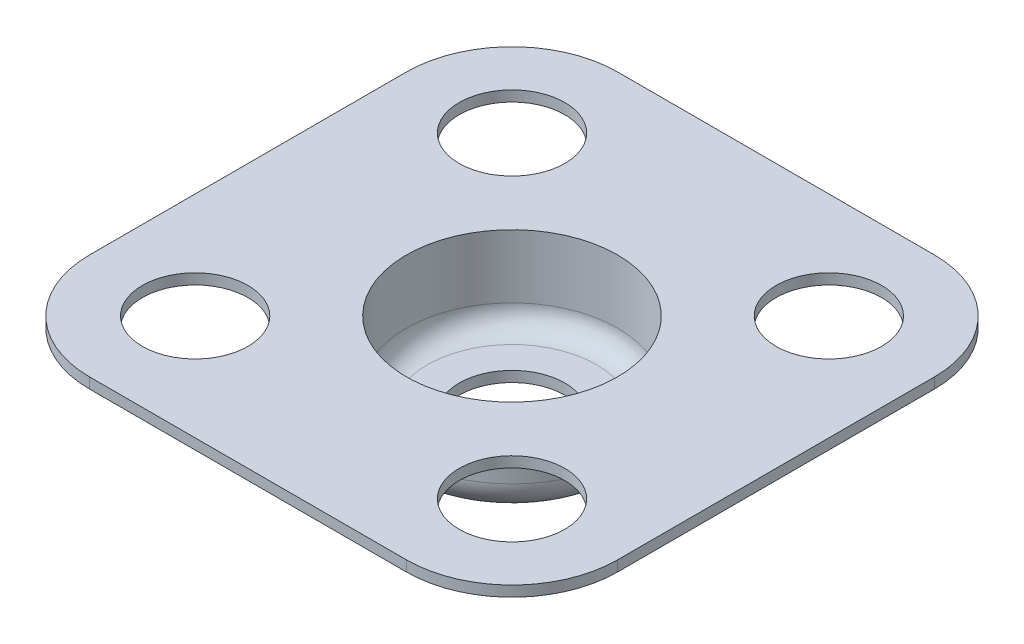
ISO-10303-21;
HEADER;
FILE_DESCRIPTION(('STEP AP214'),'2;1');
FILE_NAME('part.step','',(''),(''),'','','');
FILE_SCHEMA(('AUTOMOTIVE_DESIGN { 1 0 10303 214 1 1 1 1 }'));
ENDSEC;
DATA;
#1=APPLICATION_CONTEXT('core data for automotive mechanical design processes');
#2=APPLICATION_PROTOCOL_DEFINITION('international standard','automotive_design',2000,#1);
#3=PRODUCT_CONTEXT('',#1,'mechanical');
#4=PRODUCT('Part','Part','',(#3));
#5=PRODUCT_RELATED_PRODUCT_CATEGORY('part','',(#4));
#6=PRODUCT_DEFINITION_FORMATION('','',#4);
#7=PRODUCT_DEFINITION_CONTEXT('part definition',#1,'design');
#8=PRODUCT_DEFINITION('design','',#6,#7);
#9=PRODUCT_DEFINITION_SHAPE('','',#8);
#10=(LENGTH_UNIT() NAMED_UNIT(*) SI_UNIT(.MILLI.,.METRE.));
#11=(NAMED_UNIT(*) PLANE_ANGLE_UNIT() SI_UNIT($,.RADIAN.));
#12=(NAMED_UNIT(*) SI_UNIT($,.STERADIAN.) SOLID_ANGLE_UNIT());
#13=UNCERTAINTY_MEASURE_WITH_UNIT(LENGTH_MEASURE(1.E-05),#10,'distance_accuracy_value','');
#14=(GEOMETRIC_REPRESENTATION_CONTEXT(3) GLOBAL_UNCERTAINTY_ASSIGNED_CONTEXT((#13)) GLOBAL_UNIT_ASSIGNED_CONTEXT((#10,
#11,#12)) REPRESENTATION_CONTEXT('',''));
#15=CARTESIAN_POINT('',(0.,0.,0.));
#16=DIRECTION('',(0.,0.,1.));
#17=DIRECTION('',(1.,0.,0.));
#18=AXIS2_PLACEMENT_3D('',#15,#16,#17);
#19=CARTESIAN_POINT('',(40.,2.,-40.));
#20=DIRECTION('',(0.,1.,0.));
#21=DIRECTION('',(0.,0.,1.));
#22=AXIS2_PLACEMENT_3D('',#19,#20,#21);
#23=CYLINDRICAL_SURFACE('',#22,10.);
#24=DIRECTION('',(0.,1.,0.));
#25=VECTOR('',#24,1.);
#26=CARTESIAN_POINT('',(50.,2.,-39.9999999999999));
#27=LINE('',#26,#25);
#28=CARTESIAN_POINT('',(50.,1.,-39.9999999999999));
#29=VERTEX_POINT('',#28);
#30=CARTESIAN_POINT('',(50.,2.,-39.9999999999999));
#31=VERTEX_POINT('',#30);
#32=EDGE_CURVE('E54',#29,#31,#27,.T.);
#33=ORIENTED_EDGE('',*,*,#32,.F.);
#34=CARTESIAN_POINT('',(40.,1.,-40.));
#35=DIRECTION('',(0.,1.,0.));
#36=DIRECTION('',(0.,0.,1.));
#37=AXIS2_PLACEMENT_3D('',#34,#35,#36);
#38=CIRCLE('',#37,10.);
#39=CARTESIAN_POINT('',(39.9999999999999,1.,-50.));
#40=VERTEX_POINT('',#39);
#41=EDGE_CURVE('E116',#29,#40,#38,.T.);
#42=ORIENTED_EDGE('',*,*,#41,.T.);
#43=DIRECTION('',(0.,1.,0.));
#44=VECTOR('',#43,1.);
#45=CARTESIAN_POINT('',(39.9999999999999,2.,-50.));
#46=LINE('',#45,#44);
#47=CARTESIAN_POINT('',(39.9999999999999,2.,-50.));
#48=VERTEX_POINT('',#47);
#49=EDGE_CURVE('E160',#40,#48,#46,.T.);
#50=ORIENTED_EDGE('',*,*,#49,.T.);
#51=CARTESIAN_POINT('',(40.,2.,-40.));
#52=DIRECTION('',(0.,1.,0.));
#53=DIRECTION('',(0.,0.,1.));
#54=AXIS2_PLACEMENT_3D('',#51,#52,#53);
#55=CIRCLE('',#54,10.);
#56=EDGE_CURVE('E171',#31,#48,#55,.T.);
#57=ORIENTED_EDGE('',*,*,#56,.F.);
#58=EDGE_LOOP('',(#33,#42,#50,#57));
#59=FACE_BOUND('',#58,.T.);
#60=ADVANCED_FACE('F44',(#59),#23,.T.);
#61=CARTESIAN_POINT('',(39.9999999999999,2.,-50.));
#62=DIRECTION('',(0.,0.,-1.));
#63=DIRECTION('',(-1.,0.,0.));
#64=AXIS2_PLACEMENT_3D('',#61,#62,#63);
#65=PLANE('',#64);
#66=ORIENTED_EDGE('',*,*,#49,.F.);
#67=DIRECTION('',(1.,0.,0.));
#68=VECTOR('',#67,1.);
#69=CARTESIAN_POINT('',(40.,1.,-50.));
#70=LINE('',#69,#68);
#71=CARTESIAN_POINT('',(10.0000000000001,1.,-50.));
#72=VERTEX_POINT('',#71);
#73=EDGE_CURVE('E138',#40,#72,#70,.F.);
#74=ORIENTED_EDGE('',*,*,#73,.T.);
#75=DIRECTION('',(0.,1.,0.));
#76=VECTOR('',#75,1.);
#77=CARTESIAN_POINT('',(10.0000000000001,2.,-50.));
#78=LINE('',#77,#76);
#79=CARTESIAN_POINT('',(10.0000000000001,2.,-50.));
#80=VERTEX_POINT('',#79);
#81=EDGE_CURVE('E157',#72,#80,#78,.T.);
#82=ORIENTED_EDGE('',*,*,#81,.T.);
#83=DIRECTION('',(-1.,0.,0.));
#84=VECTOR('',#83,1.);
#85=CARTESIAN_POINT('',(39.9999999999999,2.,-50.));
#86=LINE('',#85,#84);
#87=EDGE_CURVE('E176',#48,#80,#86,.T.);
#88=ORIENTED_EDGE('',*,*,#87,.F.);
#89=EDGE_LOOP('',(#66,#74,#82,#88));
#90=FACE_BOUND('',#89,.T.);
#91=ADVANCED_FACE('F236',(#90),#65,.T.);
#92=CARTESIAN_POINT('',(10.,2.,-40.));
#93=DIRECTION('',(0.,1.,0.));
#94=DIRECTION('',(0.,0.,1.));
#95=AXIS2_PLACEMENT_3D('',#92,#93,#94);
#96=CYLINDRICAL_SURFACE('',#95,10.);
#97=ORIENTED_EDGE('',*,*,#81,.F.);
#98=CARTESIAN_POINT('',(10.,1.,-40.));
#99=DIRECTION('',(0.,1.,0.));
#100=DIRECTION('',(0.,0.,1.));
#101=AXIS2_PLACEMENT_3D('',#98,#99,#100);
#102=CIRCLE('',#101,10.);
#103=CARTESIAN_POINT('',(0.,1.,-39.9999999999999));
#104=VERTEX_POINT('',#103);
#105=EDGE_CURVE('E135',#72,#104,#102,.T.);
#106=ORIENTED_EDGE('',*,*,#105,.T.);
#107=DIRECTION('',(0.,1.,0.));
#108=VECTOR('',#107,1.);
#109=CARTESIAN_POINT('',(0.,2.,-39.9999999999999));
#110=LINE('',#109,#108);
#111=CARTESIAN_POINT('',(0.,2.,-39.9999999999999));
#112=VERTEX_POINT('',#111);
#113=EDGE_CURVE('E154',#104,#112,#110,.T.);
#114=ORIENTED_EDGE('',*,*,#113,.T.);
#115=CARTESIAN_POINT('',(10.,2.,-40.));
#116=DIRECTION('',(0.,1.,0.));
#117=DIRECTION('',(0.,0.,1.));
#118=AXIS2_PLACEMENT_3D('',#115,#116,#117);
#119=CIRCLE('',#118,10.);
#120=EDGE_CURVE('E178',#80,#112,#119,.T.);
#121=ORIENTED_EDGE('',*,*,#120,.F.);
#122=EDGE_LOOP('',(#97,#106,#114,#121));
#123=FACE_BOUND('',#122,.T.);
#124=ADVANCED_FACE('F241',(#123),#96,.T.);
#125=CARTESIAN_POINT('',(0.,2.,-39.9999999999999));
#126=DIRECTION('',(-1.,0.,0.));
#127=DIRECTION('',(0.,0.,1.));
#128=AXIS2_PLACEMENT_3D('',#125,#126,#127);
#129=PLANE('',#128);
#130=ORIENTED_EDGE('',*,*,#113,.F.);
#131=DIRECTION('',(0.,0.,1.));
#132=VECTOR('',#131,1.);
#133=CARTESIAN_POINT('',(0.,1.,-10.));
#134=LINE('',#133,#132);
#135=CARTESIAN_POINT('',(0.,1.,-10.0000000000001));
#136=VERTEX_POINT('',#135);
#137=EDGE_CURVE('E132',#104,#136,#134,.T.);
#138=ORIENTED_EDGE('',*,*,#137,.T.);
#139=DIRECTION('',(0.,1.,0.));
#140=VECTOR('',#139,1.);
#141=CARTESIAN_POINT('',(0.,2.,-10.0000000000001));
#142=LINE('',#141,#140);
#143=CARTESIAN_POINT('',(0.,2.,-10.0000000000001));
#144=VERTEX_POINT('',#143);
#145=EDGE_CURVE('E151',#136,#144,#142,.T.);
#146=ORIENTED_EDGE('',*,*,#145,.T.);
#147=DIRECTION('',(0.,0.,1.));
#148=VECTOR('',#147,1.);
#149=CARTESIAN_POINT('',(0.,2.,-39.9999999999999));
#150=LINE('',#149,#148);
#151=EDGE_CURVE('E184',#112,#144,#150,.T.);
#152=ORIENTED_EDGE('',*,*,#151,.F.);
#153=EDGE_LOOP('',(#130,#138,#146,#152));
#154=FACE_BOUND('',#153,.T.);
#155=ADVANCED_FACE('F387',(#154),#129,.T.);
#156=CARTESIAN_POINT('',(10.,2.,-10.));
#157=DIRECTION('',(0.,1.,0.));
#158=DIRECTION('',(0.,0.,1.));
#159=AXIS2_PLACEMENT_3D('',#156,#157,#158);
#160=CYLINDRICAL_SURFACE('',#159,10.);
#161=ORIENTED_EDGE('',*,*,#145,.F.);
#162=CARTESIAN_POINT('',(10.,1.,-10.));
#163=DIRECTION('',(0.,1.,0.));
#164=DIRECTION('',(0.,0.,1.));
#165=AXIS2_PLACEMENT_3D('',#162,#163,#164);
#166=CIRCLE('',#165,10.);
#167=CARTESIAN_POINT('',(10.0000000000001,1.,0.));
#168=VERTEX_POINT('',#167);
#169=EDGE_CURVE('E129',#136,#168,#166,.T.);
#170=ORIENTED_EDGE('',*,*,#169,.T.);
#171=DIRECTION('',(0.,1.,0.));
#172=VECTOR('',#171,1.);
#173=CARTESIAN_POINT('',(10.0000000000001,2.,0.));
#174=LINE('',#173,#172);
#175=CARTESIAN_POINT('',(10.0000000000001,2.,0.));
#176=VERTEX_POINT('',#175);
#177=EDGE_CURVE('E149',#168,#176,#174,.T.);
#178=ORIENTED_EDGE('',*,*,#177,.T.);
#179=CARTESIAN_POINT('',(10.,2.,-10.));
#180=DIRECTION('',(0.,1.,0.));
#181=DIRECTION('',(0.,0.,-1.));
#182=AXIS2_PLACEMENT_3D('',#179,#180,#181);
#183=CIRCLE('',#182,10.);
#184=EDGE_CURVE('E187',#144,#176,#183,.T.);
#185=ORIENTED_EDGE('',*,*,#184,.F.);
#186=EDGE_LOOP('',(#161,#170,#178,#185));
#187=FACE_BOUND('',#186,.T.);
#188=ADVANCED_FACE('F384',(#187),#160,.T.);
#189=CARTESIAN_POINT('',(10.0000000000001,2.,0.));
#190=DIRECTION('',(0.,0.,1.));
#191=DIRECTION('',(1.,0.,0.));
#192=AXIS2_PLACEMENT_3D('',#189,#190,#191);
#193=PLANE('',#192);
#194=ORIENTED_EDGE('',*,*,#177,.F.);
#195=DIRECTION('',(1.,0.,0.));
#196=VECTOR('',#195,1.);
#197=CARTESIAN_POINT('',(40.,1.,0.));
#198=LINE('',#197,#196);
#199=CARTESIAN_POINT('',(39.9999999999999,1.,0.));
#200=VERTEX_POINT('',#199);
#201=EDGE_CURVE('E126',#168,#200,#198,.T.);
#202=ORIENTED_EDGE('',*,*,#201,.T.);
#203=DIRECTION('',(0.,1.,0.));
#204=VECTOR('',#203,1.);
#205=CARTESIAN_POINT('',(39.9999999999999,2.,0.));
#206=LINE('',#205,#204);
#207=CARTESIAN_POINT('',(39.9999999999999,2.,0.));
#208=VERTEX_POINT('',#207);
#209=EDGE_CURVE('E62',#200,#208,#206,.T.);
#210=ORIENTED_EDGE('',*,*,#209,.T.);
#211=DIRECTION('',(1.,0.,0.));
#212=VECTOR('',#211,1.);
#213=CARTESIAN_POINT('',(10.0000000000001,2.,0.));
#214=LINE('',#213,#212);
#215=EDGE_CURVE('E190',#176,#208,#214,.T.);
#216=ORIENTED_EDGE('',*,*,#215,.F.);
#217=EDGE_LOOP('',(#194,#202,#210,#216));
#218=FACE_BOUND('',#217,.T.);
#219=ADVANCED_FACE('F381',(#218),#193,.T.);
#220=CARTESIAN_POINT('',(40.,2.,-10.));
#221=DIRECTION('',(0.,1.,0.));
#222=DIRECTION('',(0.,0.,1.));
#223=AXIS2_PLACEMENT_3D('',#220,#221,#222);
#224=CYLINDRICAL_SURFACE('',#223,10.);
#225=ORIENTED_EDGE('',*,*,#209,.F.);
#226=CARTESIAN_POINT('',(40.,1.,-10.));
#227=DIRECTION('',(0.,1.,0.));
#228=DIRECTION('',(0.,0.,1.));
#229=AXIS2_PLACEMENT_3D('',#226,#227,#228);
#230=CIRCLE('',#229,10.);
#231=CARTESIAN_POINT('',(50.,1.,-10.0000000000001));
#232=VERTEX_POINT('',#231);
#233=EDGE_CURVE('E114',#200,#232,#230,.T.);
#234=ORIENTED_EDGE('',*,*,#233,.T.);
#235=DIRECTION('',(0.,1.,0.));
#236=VECTOR('',#235,1.);
#237=CARTESIAN_POINT('',(50.,2.,-10.0000000000001));
#238=LINE('',#237,#236);
#239=CARTESIAN_POINT('',(50.,2.,-10.0000000000001));
#240=VERTEX_POINT('',#239);
#241=EDGE_CURVE('E98',#232,#240,#238,.T.);
#242=ORIENTED_EDGE('',*,*,#241,.T.);
#243=CARTESIAN_POINT('',(40.,2.,-10.));
#244=DIRECTION('',(0.,1.,0.));
#245=DIRECTION('',(0.,0.,1.));
#246=AXIS2_PLACEMENT_3D('',#243,#244,#245);
#247=CIRCLE('',#246,10.);
#248=EDGE_CURVE('E174',#208,#240,#247,.T.);
#249=ORIENTED_EDGE('',*,*,#248,.F.);
#250=EDGE_LOOP('',(#225,#234,#242,#249));
#251=FACE_BOUND('',#250,.T.);
#252=ADVANCED_FACE('F118',(#251),#224,.T.);
#253=CARTESIAN_POINT('',(10.0000000000003,2.,-9.99999999999968));
#254=DIRECTION('',(0.,1.,0.));
#255=DIRECTION('',(0.,0.,1.));
#256=AXIS2_PLACEMENT_3D('',#253,#254,#255);
#257=CYLINDRICAL_SURFACE('',#256,5.);
#258=CARTESIAN_POINT('',(10.0000000000003,2.,-9.99999999999968));
#259=DIRECTION('',(0.,1.,0.));
#260=DIRECTION('',(0.,0.,1.));
#261=AXIS2_PLACEMENT_3D('',#258,#259,#260);
#262=CIRCLE('',#261,5.);
#263=CARTESIAN_POINT('',(10.0000000000003,2.,-4.99999999999968));
#264=VERTEX_POINT('',#263);
#265=EDGE_CURVE('E147',#264,#264,#262,.T.);
#266=ORIENTED_EDGE('',*,*,#265,.T.);
#267=EDGE_LOOP('',(#266));
#268=FACE_BOUND('',#267,.T.);
#269=CARTESIAN_POINT('',(10.0000000000003,1.,-9.99999999999968));
#270=DIRECTION('',(0.,1.,0.));
#271=DIRECTION('',(0.,0.,1.));
#272=AXIS2_PLACEMENT_3D('',#269,#270,#271);
#273=CIRCLE('',#272,5.);
#274=CARTESIAN_POINT('',(10.0000000000003,1.,-4.99999999999968));
#275=VERTEX_POINT('',#274);
#276=EDGE_CURVE('E122',#275,#275,#273,.T.);
#277=ORIENTED_EDGE('',*,*,#276,.F.);
#278=EDGE_LOOP('',(#277));
#279=FACE_BOUND('',#278,.T.);
#280=ADVANCED_FACE('F371',(#268,#279),#257,.F.);
#281=CARTESIAN_POINT('',(40.,2.,-40.));
#282=DIRECTION('',(0.,1.,0.));
#283=DIRECTION('',(0.,0.,1.));
#284=AXIS2_PLACEMENT_3D('',#281,#282,#283);
#285=CYLINDRICAL_SURFACE('',#284,5.);
#286=CARTESIAN_POINT('',(40.,2.,-40.));
#287=DIRECTION('',(0.,1.,0.));
#288=DIRECTION('',(0.,0.,1.));
#289=AXIS2_PLACEMENT_3D('',#286,#287,#288);
#290=CIRCLE('',#289,5.);
#291=CARTESIAN_POINT('',(40.,2.,-35.));
#292=VERTEX_POINT('',#291);
#293=EDGE_CURVE('E214',#292,#292,#290,.T.);
#294=ORIENTED_EDGE('',*,*,#293,.T.);
#295=EDGE_LOOP('',(#294));
#296=FACE_BOUND('',#295,.T.);
#297=CARTESIAN_POINT('',(40.,1.,-40.));
#298=DIRECTION('',(0.,1.,0.));
#299=DIRECTION('',(0.,0.,1.));
#300=AXIS2_PLACEMENT_3D('',#297,#298,#299);
#301=CIRCLE('',#300,5.);
#302=CARTESIAN_POINT('',(40.,1.,-35.));
#303=VERTEX_POINT('',#302);
#304=EDGE_CURVE('E119',#303,#303,#301,.T.);
#305=ORIENTED_EDGE('',*,*,#304,.F.);
#306=EDGE_LOOP('',(#305));
#307=FACE_BOUND('',#306,.T.);
#308=ADVANCED_FACE('F218',(#296,#307),#285,.F.);
#309=CARTESIAN_POINT('',(50.,2.,-10.0000000000001));
#310=DIRECTION('',(1.,0.,0.));
#311=DIRECTION('',(0.,0.,-1.));
#312=AXIS2_PLACEMENT_3D('',#309,#310,#311);
#313=PLANE('',#312);
#314=DIRECTION('',(0.,0.,1.));
#315=VECTOR('',#314,1.);
#316=CARTESIAN_POINT('',(50.,1.,-10.));
#317=LINE('',#316,#315);
#318=EDGE_CURVE('E101',#232,#29,#317,.F.);
#319=ORIENTED_EDGE('',*,*,#318,.T.);
#320=ORIENTED_EDGE('',*,*,#32,.T.);
#321=DIRECTION('',(0.,0.,-1.));
#322=VECTOR('',#321,1.);
#323=CARTESIAN_POINT('',(50.,2.,-10.0000000000001));
#324=LINE('',#323,#322);
#325=EDGE_CURVE('E103',#240,#31,#324,.T.);
#326=ORIENTED_EDGE('',*,*,#325,.F.);
#327=ORIENTED_EDGE('',*,*,#241,.F.);
#328=EDGE_LOOP('',(#319,#320,#326,#327));
#329=FACE_BOUND('',#328,.T.);
#330=ADVANCED_FACE('F100',(#329),#313,.T.);
#331=CARTESIAN_POINT('',(40.0000000000004,2.,-9.99999999999995));
#332=DIRECTION('',(0.,1.,0.));
#333=DIRECTION('',(0.,0.,1.));
#334=AXIS2_PLACEMENT_3D('',#331,#332,#333);
#335=CYLINDRICAL_SURFACE('',#334,5.);
#336=CARTESIAN_POINT('',(40.0000000000004,2.,-9.99999999999995));
#337=DIRECTION('',(0.,1.,0.));
#338=DIRECTION('',(0.,0.,1.));
#339=AXIS2_PLACEMENT_3D('',#336,#337,#338);
#340=CIRCLE('',#339,5.);
#341=CARTESIAN_POINT('',(40.0000000000004,2.,-4.99999999999995));
#342=VERTEX_POINT('',#341);
#343=EDGE_CURVE('E192',#342,#342,#340,.T.);
#344=ORIENTED_EDGE('',*,*,#343,.T.);
#345=EDGE_LOOP('',(#344));
#346=FACE_BOUND('',#345,.T.);
#347=CARTESIAN_POINT('',(40.0000000000004,1.,-9.99999999999995));
#348=DIRECTION('',(0.,1.,0.));
#349=DIRECTION('',(0.,0.,1.));
#350=AXIS2_PLACEMENT_3D('',#347,#348,#349);
#351=CIRCLE('',#350,5.);
#352=CARTESIAN_POINT('',(40.0000000000004,1.,-4.99999999999995));
#353=VERTEX_POINT('',#352);
#354=EDGE_CURVE('E128',#353,#353,#351,.T.);
#355=ORIENTED_EDGE('',*,*,#354,.F.);
#356=EDGE_LOOP('',(#355));
#357=FACE_BOUND('',#356,.T.);
#358=ADVANCED_FACE('F231',(#346,#357),#335,.F.);
#359=CARTESIAN_POINT('',(10.,2.,-40.));
#360=DIRECTION('',(0.,1.,0.));
#361=DIRECTION('',(0.,0.,1.));
#362=AXIS2_PLACEMENT_3D('',#359,#360,#361);
#363=CYLINDRICAL_SURFACE('',#362,4.9999999999997);
#364=CARTESIAN_POINT('',(10.,2.,-40.));
#365=DIRECTION('',(0.,1.,0.));
#366=DIRECTION('',(0.,0.,1.));
#367=AXIS2_PLACEMENT_3D('',#364,#365,#366);
#368=CIRCLE('',#367,4.9999999999997);
#369=CARTESIAN_POINT('',(10.,2.,-35.0000000000003));
#370=VERTEX_POINT('',#369);
#371=EDGE_CURVE('E107',#370,#370,#368,.T.);
#372=ORIENTED_EDGE('',*,*,#371,.T.);
#373=EDGE_LOOP('',(#372));
#374=FACE_BOUND('',#373,.T.);
#375=CARTESIAN_POINT('',(10.,1.,-40.));
#376=DIRECTION('',(0.,1.,0.));
#377=DIRECTION('',(0.,0.,1.));
#378=AXIS2_PLACEMENT_3D('',#375,#376,#377);
#379=CIRCLE('',#378,4.9999999999997);
#380=CARTESIAN_POINT('',(10.,1.,-35.0000000000003));
#381=VERTEX_POINT('',#380);
#382=EDGE_CURVE('E144',#381,#381,#379,.T.);
#383=ORIENTED_EDGE('',*,*,#382,.F.);
#384=EDGE_LOOP('',(#383));
#385=FACE_BOUND('',#384,.T.);
#386=ADVANCED_FACE('F46',(#374,#385),#363,.F.);
#387=CARTESIAN_POINT('',(40.,2.,-10.));
#388=DIRECTION('',(0.,1.,0.));
#389=DIRECTION('',(0.,0.,1.));
#390=AXIS2_PLACEMENT_3D('',#387,#388,#389);
#391=PLANE('',#390);
#392=ORIENTED_EDGE('',*,*,#265,.F.);
#393=EDGE_LOOP('',(#392));
#394=FACE_BOUND('',#393,.T.);
#395=ORIENTED_EDGE('',*,*,#293,.F.);
#396=EDGE_LOOP('',(#395));
#397=FACE_BOUND('',#396,.T.);
#398=ORIENTED_EDGE('',*,*,#248,.T.);
#399=ORIENTED_EDGE('',*,*,#325,.T.);
#400=ORIENTED_EDGE('',*,*,#56,.T.);
#401=ORIENTED_EDGE('',*,*,#87,.T.);
#402=ORIENTED_EDGE('',*,*,#120,.T.);
#403=ORIENTED_EDGE('',*,*,#151,.T.);
#404=ORIENTED_EDGE('',*,*,#184,.T.);
#405=ORIENTED_EDGE('',*,*,#215,.T.);
#406=EDGE_LOOP('',(#398,#399,#400,#401,#402,#403,#404,#405));
#407=FACE_BOUND('',#406,.T.);
#408=ORIENTED_EDGE('',*,*,#343,.F.);
#409=EDGE_LOOP('',(#408));
#410=FACE_BOUND('',#409,.T.);
#411=ORIENTED_EDGE('',*,*,#371,.F.);
#412=EDGE_LOOP('',(#411));
#413=FACE_BOUND('',#412,.T.);
#414=CARTESIAN_POINT('',(25.0000000000002,1.99999999989586,-24.9999999999998));
#415=DIRECTION('',(0.,1.,0.));
#416=DIRECTION('',(0.,0.,-1.));
#417=AXIS2_PLACEMENT_3D('',#414,#415,#416);
#418=CIRCLE('',#417,10.);
#419=CARTESIAN_POINT('',(25.0000000000002,1.99999999989586,-34.9999999999998));
#420=VERTEX_POINT('',#419);
#421=EDGE_CURVE('E197',#420,#420,#418,.T.);
#422=ORIENTED_EDGE('',*,*,#421,.F.);
#423=EDGE_LOOP('',(#422));
#424=FACE_BOUND('',#423,.T.);
#425=ADVANCED_FACE('F168',(#394,#397,#407,#410,#413,#424),#391,.T.);
#426=CARTESIAN_POINT('',(40.,1.,-10.));
#427=DIRECTION('',(0.,1.,0.));
#428=DIRECTION('',(0.,0.,1.));
#429=AXIS2_PLACEMENT_3D('',#426,#427,#428);
#430=PLANE('',#429);
#431=CARTESIAN_POINT('',(25.0000000000002,1.,-24.9999999999998));
#432=DIRECTION('',(0.,1.,0.));
#433=DIRECTION('',(0.,0.,1.));
#434=AXIS2_PLACEMENT_3D('',#431,#432,#433);
#435=CIRCLE('',#434,11.);
#436=CARTESIAN_POINT('',(25.0000000000002,1.,-13.9999999999998));
#437=VERTEX_POINT('',#436);
#438=EDGE_CURVE('E12',#437,#437,#435,.F.);
#439=ORIENTED_EDGE('',*,*,#438,.F.);
#440=EDGE_LOOP('',(#439));
#441=FACE_BOUND('',#440,.T.);
#442=ORIENTED_EDGE('',*,*,#276,.T.);
#443=EDGE_LOOP('',(#442));
#444=FACE_BOUND('',#443,.T.);
#445=ORIENTED_EDGE('',*,*,#304,.T.);
#446=EDGE_LOOP('',(#445));
#447=FACE_BOUND('',#446,.T.);
#448=ORIENTED_EDGE('',*,*,#233,.F.);
#449=ORIENTED_EDGE('',*,*,#201,.F.);
#450=ORIENTED_EDGE('',*,*,#169,.F.);
#451=ORIENTED_EDGE('',*,*,#137,.F.);
#452=ORIENTED_EDGE('',*,*,#105,.F.);
#453=ORIENTED_EDGE('',*,*,#73,.F.);
#454=ORIENTED_EDGE('',*,*,#41,.F.);
#455=ORIENTED_EDGE('',*,*,#318,.F.);
#456=EDGE_LOOP('',(#448,#449,#450,#451,#452,#453,#454,#455));
#457=FACE_BOUND('',#456,.T.);
#458=ORIENTED_EDGE('',*,*,#354,.T.);
#459=EDGE_LOOP('',(#458));
#460=FACE_BOUND('',#459,.T.);
#461=ORIENTED_EDGE('',*,*,#382,.T.);
#462=EDGE_LOOP('',(#461));
#463=FACE_BOUND('',#462,.T.);
#464=ADVANCED_FACE('F111',(#441,#444,#447,#457,#460,#463),#430,.F.);
#465=CARTESIAN_POINT('',(25.0000000000002,1.99999999989586,-24.9999999999998));
#466=DIRECTION('',(0.,-1.,0.));
#467=DIRECTION('',(0.,0.,1.));
#468=AXIS2_PLACEMENT_3D('',#465,#466,#467);
#469=CYLINDRICAL_SURFACE('',#468,10.);
#470=ORIENTED_EDGE('',*,*,#421,.T.);
#471=EDGE_LOOP('',(#470));
#472=FACE_BOUND('',#471,.T.);
#473=CARTESIAN_POINT('',(25.0000000000002,-4.00000000010414,-24.9999999999998));
#474=DIRECTION('',(0.,1.,0.));
#475=DIRECTION('',(0.,0.,-1.));
#476=AXIS2_PLACEMENT_3D('',#473,#474,#475);
#477=CIRCLE('',#476,10.);
#478=CARTESIAN_POINT('',(25.0000000000002,-4.00000000010414,-34.9999999999998));
#479=VERTEX_POINT('',#478);
#480=EDGE_CURVE('E206',#479,#479,#477,.T.);
#481=ORIENTED_EDGE('',*,*,#480,.F.);
#482=EDGE_LOOP('',(#481));
#483=FACE_BOUND('',#482,.T.);
#484=ADVANCED_FACE('F228',(#472,#483),#469,.F.);
#485=CARTESIAN_POINT('',(25.0000000000002,-7.00000000010414,-24.9999999999998));
#486=DIRECTION('',(0.,1.,0.));
#487=DIRECTION('',(0.,0.,-1.));
#488=AXIS2_PLACEMENT_3D('',#485,#486,#487);
#489=PLANE('',#488);
#490=CARTESIAN_POINT('',(25.0000000000002,-7.00000000010414,-24.9999999999998));
#491=DIRECTION('',(0.,-1.,0.));
#492=DIRECTION('',(0.,0.,-1.));
#493=AXIS2_PLACEMENT_3D('',#490,#491,#492);
#494=CIRCLE('',#493,5.);
#495=CARTESIAN_POINT('',(25.0000000000002,-7.00000000010414,-29.9999999999998));
#496=VERTEX_POINT('',#495);
#497=EDGE_CURVE('E356',#496,#496,#494,.T.);
#498=ORIENTED_EDGE('',*,*,#497,.F.);
#499=EDGE_LOOP('',(#498));
#500=FACE_BOUND('',#499,.T.);
#501=CARTESIAN_POINT('',(25.0000000000002,-7.00000000010414,-24.9999999999998));
#502=DIRECTION('',(0.,1.,0.));
#503=DIRECTION('',(0.,0.,1.));
#504=AXIS2_PLACEMENT_3D('',#501,#502,#503);
#505=CIRCLE('',#504,8.);
#506=CARTESIAN_POINT('',(25.0000000000002,-7.00000000010414,-16.9999999999998));
#507=VERTEX_POINT('',#506);
#508=EDGE_CURVE('E360',#507,#507,#505,.F.);
#509=ORIENTED_EDGE('',*,*,#508,.T.);
#510=EDGE_LOOP('',(#509));
#511=FACE_BOUND('',#510,.T.);
#512=ADVANCED_FACE('F289',(#500,#511),#489,.F.);
#513=CARTESIAN_POINT('',(25.0000000000002,-4.00000000010414,-24.9999999999998));
#514=DIRECTION('',(0.,1.,0.));
#515=DIRECTION('',(0.,0.,-1.));
#516=AXIS2_PLACEMENT_3D('',#513,#514,#515);
#517=TOROIDAL_SURFACE('',#516,8.,3.);
#518=ORIENTED_EDGE('',*,*,#508,.F.);
#519=EDGE_LOOP('',(#518));
#520=FACE_BOUND('',#519,.T.);
#521=CARTESIAN_POINT('',(25.0000000000002,-4.00000000010414,-24.9999999999998));
#522=DIRECTION('',(0.,-1.,0.));
#523=DIRECTION('',(0.,0.,-1.));
#524=AXIS2_PLACEMENT_3D('',#521,#522,#523);
#525=CIRCLE('',#524,11.);
#526=CARTESIAN_POINT('',(25.0000000000002,-4.00000000010414,-35.9999999999998));
#527=VERTEX_POINT('',#526);
#528=EDGE_CURVE('E210',#527,#527,#525,.F.);
#529=ORIENTED_EDGE('',*,*,#528,.F.);
#530=EDGE_LOOP('',(#529));
#531=FACE_BOUND('',#530,.T.);
#532=ADVANCED_FACE('F295',(#520,#531),#517,.T.);
#533=CARTESIAN_POINT('',(25.0000000000002,1.99999999989586,-24.9999999999998));
#534=DIRECTION('',(0.,-1.,0.));
#535=DIRECTION('',(0.,0.,1.));
#536=AXIS2_PLACEMENT_3D('',#533,#534,#535);
#537=CYLINDRICAL_SURFACE('',#536,11.);
#538=ORIENTED_EDGE('',*,*,#528,.T.);
#539=EDGE_LOOP('',(#538));
#540=FACE_BOUND('',#539,.T.);
#541=ORIENTED_EDGE('',*,*,#438,.T.);
#542=EDGE_LOOP('',(#541));
#543=FACE_BOUND('',#542,.T.);
#544=ADVANCED_FACE('F300',(#540,#543),#537,.T.);
#545=CARTESIAN_POINT('',(25.0000000000002,-4.00000000010414,-24.9999999999998));
#546=DIRECTION('',(0.,1.,0.));
#547=DIRECTION('',(0.,0.,-1.));
#548=AXIS2_PLACEMENT_3D('',#545,#546,#547);
#549=TOROIDAL_SURFACE('',#548,8.,2.);
#550=CARTESIAN_POINT('',(25.0000000000002,-6.00000000010414,-24.9999999999998));
#551=DIRECTION('',(0.,1.,0.));
#552=DIRECTION('',(0.,0.,-1.));
#553=AXIS2_PLACEMENT_3D('',#550,#551,#552);
#554=CIRCLE('',#553,8.);
#555=CARTESIAN_POINT('',(25.0000000000002,-6.00000000010414,-32.9999999999998));
#556=VERTEX_POINT('',#555);
#557=EDGE_CURVE('E201',#556,#556,#554,.F.);
#558=ORIENTED_EDGE('',*,*,#557,.T.);
#559=EDGE_LOOP('',(#558));
#560=FACE_BOUND('',#559,.T.);
#561=ORIENTED_EDGE('',*,*,#480,.T.);
#562=EDGE_LOOP('',(#561));
#563=FACE_BOUND('',#562,.T.);
#564=ADVANCED_FACE('F310',(#560,#563),#549,.F.);
#565=CARTESIAN_POINT('',(25.0000000000002,-6.00000000010414,-24.9999999999998));
#566=DIRECTION('',(0.,1.,0.));
#567=DIRECTION('',(0.,0.,-1.));
#568=AXIS2_PLACEMENT_3D('',#565,#566,#567);
#569=PLANE('',#568);
#570=CARTESIAN_POINT('',(25.0000000000002,-6.00000000010414,-24.9999999999998));
#571=DIRECTION('',(0.,1.,0.));
#572=DIRECTION('',(0.,0.,1.));
#573=AXIS2_PLACEMENT_3D('',#570,#571,#572);
#574=CIRCLE('',#573,5.);
#575=CARTESIAN_POINT('',(25.0000000000002,-6.00000000010414,-19.9999999999998));
#576=VERTEX_POINT('',#575);
#577=EDGE_CURVE('E48',#576,#576,#574,.T.);
#578=ORIENTED_EDGE('',*,*,#577,.F.);
#579=EDGE_LOOP('',(#578));
#580=FACE_BOUND('',#579,.T.);
#581=ORIENTED_EDGE('',*,*,#557,.F.);
#582=EDGE_LOOP('',(#581));
#583=FACE_BOUND('',#582,.T.);
#584=ADVANCED_FACE('F320',(#580,#583),#569,.T.);
#585=CARTESIAN_POINT('',(25.0000000000002,2.,-24.9999999999998));
#586=DIRECTION('',(0.,-1.,0.));
#587=DIRECTION('',(0.,0.,-1.));
#588=AXIS2_PLACEMENT_3D('',#585,#586,#587);
#589=CYLINDRICAL_SURFACE('',#588,5.);
#590=ORIENTED_EDGE('',*,*,#577,.T.);
#591=EDGE_LOOP('',(#590));
#592=FACE_BOUND('',#591,.T.);
#593=ORIENTED_EDGE('',*,*,#497,.T.);
#594=EDGE_LOOP('',(#593));
#595=FACE_BOUND('',#594,.T.);
#596=ADVANCED_FACE('F337',(#592,#595),#589,.F.);
#597=CLOSED_SHELL('',(#60,#91,#124,#155,#188,#219,#252,#280,#308,#330,#358,#386,#425,#464,#484,
#512,#532,#544,#564,#584,#596));
#598=MANIFOLD_SOLID_BREP('B2',#597);
#599=ADVANCED_BREP_SHAPE_REPRESENTATION('',(#18,#598),#14);
#600=SHAPE_DEFINITION_REPRESENTATION(#9,#599);
ENDSEC;
END-ISO-10303-21;
